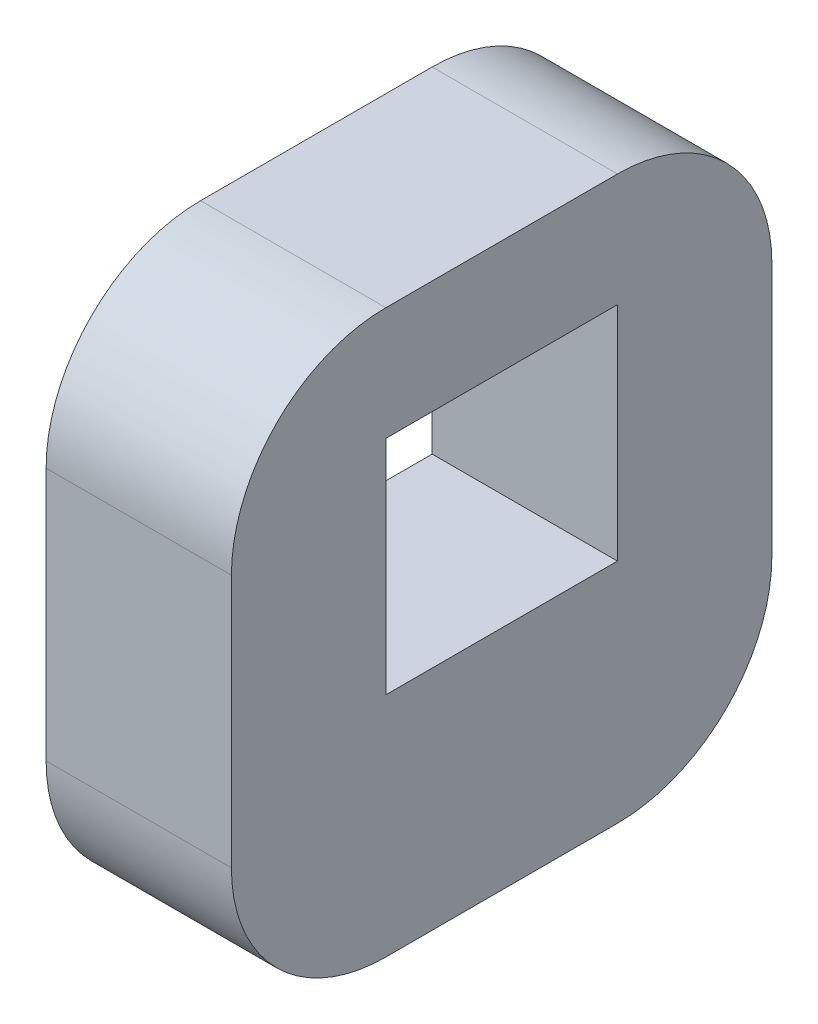
ISO-10303-21;
HEADER;
FILE_DESCRIPTION(('STEP AP214'),'2;1');
FILE_NAME('part.step','',(''),(''),'','','');
FILE_SCHEMA(('AUTOMOTIVE_DESIGN { 1 0 10303 214 1 1 1 1 }'));
ENDSEC;
DATA;
#1=APPLICATION_CONTEXT('core data for automotive mechanical design processes');
#2=APPLICATION_PROTOCOL_DEFINITION('international standard','automotive_design',2000,#1);
#3=PRODUCT_CONTEXT('',#1,'mechanical');
#4=PRODUCT('Part','Part','',(#3));
#5=PRODUCT_RELATED_PRODUCT_CATEGORY('part','',(#4));
#6=PRODUCT_DEFINITION_FORMATION('','',#4);
#7=PRODUCT_DEFINITION_CONTEXT('part definition',#1,'design');
#8=PRODUCT_DEFINITION('design','',#6,#7);
#9=PRODUCT_DEFINITION_SHAPE('','',#8);
#10=(LENGTH_UNIT() NAMED_UNIT(*) SI_UNIT(.MILLI.,.METRE.));
#11=(NAMED_UNIT(*) PLANE_ANGLE_UNIT() SI_UNIT($,.RADIAN.));
#12=(NAMED_UNIT(*) SI_UNIT($,.STERADIAN.) SOLID_ANGLE_UNIT());
#13=UNCERTAINTY_MEASURE_WITH_UNIT(LENGTH_MEASURE(1.E-05),#10,'distance_accuracy_value','');
#14=(GEOMETRIC_REPRESENTATION_CONTEXT(3) GLOBAL_UNCERTAINTY_ASSIGNED_CONTEXT((#13)) GLOBAL_UNIT_ASSIGNED_CONTEXT((#10,
#11,#12)) REPRESENTATION_CONTEXT('',''));
#15=CARTESIAN_POINT('',(0.,0.,0.));
#16=DIRECTION('',(0.,0.,1.));
#17=DIRECTION('',(1.,0.,0.));
#18=AXIS2_PLACEMENT_3D('',#15,#16,#17);
#19=CARTESIAN_POINT('',(69.9352461515029,5.5,6.75));
#20=DIRECTION('',(1.,0.,0.));
#21=DIRECTION('',(0.,0.,-1.));
#22=AXIS2_PLACEMENT_3D('',#19,#20,#21);
#23=PLANE('',#22);
#24=DIRECTION('',(0.,0.,-1.));
#25=VECTOR('',#24,1.);
#26=CARTESIAN_POINT('',(69.9352461515029,-7.70774354332595,11.75));
#27=LINE('',#26,#25);
#28=CARTESIAN_POINT('',(69.9352461515029,-7.70774354332595,6.75));
#29=VERTEX_POINT('',#28);
#30=CARTESIAN_POINT('',(69.9352461515029,-7.70774354332595,-0.749999999999997));
#31=VERTEX_POINT('',#30);
#32=EDGE_CURVE('E168',#29,#31,#27,.T.);
#33=ORIENTED_EDGE('',*,*,#32,.T.);
#34=CARTESIAN_POINT('',(69.9352461515029,-2.70774354332595,-0.749999999999997));
#35=DIRECTION('',(1.,0.,0.));
#36=DIRECTION('',(0.,0.,-1.));
#37=AXIS2_PLACEMENT_3D('',#34,#35,#36);
#38=CIRCLE('',#37,5.);
#39=CARTESIAN_POINT('',(69.9352461515029,-2.70774354332595,-5.75));
#40=VERTEX_POINT('',#39);
#41=EDGE_CURVE('E38',#31,#40,#38,.T.);
#42=ORIENTED_EDGE('',*,*,#41,.T.);
#43=DIRECTION('',(0.,1.,0.));
#44=VECTOR('',#43,1.);
#45=CARTESIAN_POINT('',(69.9352461515029,-7.70774354332595,-5.75));
#46=LINE('',#45,#44);
#47=CARTESIAN_POINT('',(69.9352461515029,5.5,-5.75));
#48=VERTEX_POINT('',#47);
#49=EDGE_CURVE('E170',#40,#48,#46,.T.);
#50=ORIENTED_EDGE('',*,*,#49,.T.);
#51=CARTESIAN_POINT('',(69.9352461515029,5.5,-0.749999999999997));
#52=DIRECTION('',(1.,0.,0.));
#53=DIRECTION('',(0.,0.,1.));
#54=AXIS2_PLACEMENT_3D('',#51,#52,#53);
#55=CIRCLE('',#54,5.);
#56=CARTESIAN_POINT('',(69.9352461515029,10.5,-0.749999999999997));
#57=VERTEX_POINT('',#56);
#58=EDGE_CURVE('E172',#48,#57,#55,.T.);
#59=ORIENTED_EDGE('',*,*,#58,.T.);
#60=DIRECTION('',(0.,0.,1.));
#61=VECTOR('',#60,1.);
#62=CARTESIAN_POINT('',(69.9352461515029,10.5,6.75));
#63=LINE('',#62,#61);
#64=CARTESIAN_POINT('',(69.9352461515029,10.5,6.75));
#65=VERTEX_POINT('',#64);
#66=EDGE_CURVE('E174',#57,#65,#63,.T.);
#67=ORIENTED_EDGE('',*,*,#66,.T.);
#68=CARTESIAN_POINT('',(69.9352461515029,5.5,6.75));
#69=DIRECTION('',(1.,0.,0.));
#70=DIRECTION('',(0.,0.,-1.));
#71=AXIS2_PLACEMENT_3D('',#68,#69,#70);
#72=CIRCLE('',#71,5.);
#73=CARTESIAN_POINT('',(69.9352461515029,5.5,11.75));
#74=VERTEX_POINT('',#73);
#75=EDGE_CURVE('E162',#65,#74,#72,.T.);
#76=ORIENTED_EDGE('',*,*,#75,.T.);
#77=DIRECTION('',(0.,-1.,0.));
#78=VECTOR('',#77,1.);
#79=CARTESIAN_POINT('',(69.9352461515029,5.5,11.75));
#80=LINE('',#79,#78);
#81=CARTESIAN_POINT('',(69.9352461515029,-2.70774354332595,11.75));
#82=VERTEX_POINT('',#81);
#83=EDGE_CURVE('E165',#74,#82,#80,.T.);
#84=ORIENTED_EDGE('',*,*,#83,.T.);
#85=CARTESIAN_POINT('',(69.9352461515029,-2.70774354332595,6.75));
#86=DIRECTION('',(1.,0.,0.));
#87=DIRECTION('',(0.,0.,-1.));
#88=AXIS2_PLACEMENT_3D('',#85,#86,#87);
#89=CIRCLE('',#88,5.);
#90=EDGE_CURVE('E210',#82,#29,#89,.T.);
#91=ORIENTED_EDGE('',*,*,#90,.T.);
#92=EDGE_LOOP('',(#33,#42,#50,#59,#67,#76,#84,#91));
#93=FACE_BOUND('',#92,.T.);
#94=DIRECTION('',(0.,0.,-1.));
#95=VECTOR('',#94,1.);
#96=CARTESIAN_POINT('',(69.9352461515029,-0.355000000000019,6.75));
#97=LINE('',#96,#95);
#98=CARTESIAN_POINT('',(69.9352461515029,-0.355000000000019,6.75));
#99=VERTEX_POINT('',#98);
#100=CARTESIAN_POINT('',(69.9352461515029,-0.355000000000019,-0.749999999999997));
#101=VERTEX_POINT('',#100);
#102=EDGE_CURVE('E131',#99,#101,#97,.T.);
#103=ORIENTED_EDGE('',*,*,#102,.F.);
#104=DIRECTION('',(0.,-1.,0.));
#105=VECTOR('',#104,1.);
#106=CARTESIAN_POINT('',(69.9352461515029,6.83499999999998,6.75));
#107=LINE('',#106,#105);
#108=CARTESIAN_POINT('',(69.9352461515029,6.83499999999998,6.75));
#109=VERTEX_POINT('',#108);
#110=EDGE_CURVE('E121',#109,#99,#107,.T.);
#111=ORIENTED_EDGE('',*,*,#110,.F.);
#112=DIRECTION('',(0.,0.,1.));
#113=VECTOR('',#112,1.);
#114=CARTESIAN_POINT('',(69.9352461515029,6.83499999999998,6.75));
#115=LINE('',#114,#113);
#116=CARTESIAN_POINT('',(69.9352461515029,6.83499999999998,-0.749999999999996));
#117=VERTEX_POINT('',#116);
#118=EDGE_CURVE('E146',#117,#109,#115,.T.);
#119=ORIENTED_EDGE('',*,*,#118,.F.);
#120=DIRECTION('',(0.,1.,0.));
#121=VECTOR('',#120,1.);
#122=CARTESIAN_POINT('',(69.9352461515029,6.83499999999998,-0.749999999999996));
#123=LINE('',#122,#121);
#124=EDGE_CURVE('E144',#101,#117,#123,.T.);
#125=ORIENTED_EDGE('',*,*,#124,.F.);
#126=EDGE_LOOP('',(#103,#111,#119,#125));
#127=FACE_BOUND('',#126,.T.);
#128=ADVANCED_FACE('F30',(#93,#127),#23,.T.);
#129=CARTESIAN_POINT('',(63.9352461515029,5.5,6.75));
#130=DIRECTION('',(1.,0.,0.));
#131=DIRECTION('',(0.,0.,-1.));
#132=AXIS2_PLACEMENT_3D('',#129,#130,#131);
#133=PLANE('',#132);
#134=DIRECTION('',(0.,1.,0.));
#135=VECTOR('',#134,1.);
#136=CARTESIAN_POINT('',(63.9352461515029,-7.70774354332595,-5.75));
#137=LINE('',#136,#135);
#138=CARTESIAN_POINT('',(63.9352461515029,-2.70774354332595,-5.75));
#139=VERTEX_POINT('',#138);
#140=CARTESIAN_POINT('',(63.9352461515029,5.5,-5.75));
#141=VERTEX_POINT('',#140);
#142=EDGE_CURVE('E183',#139,#141,#137,.T.);
#143=ORIENTED_EDGE('',*,*,#142,.F.);
#144=CARTESIAN_POINT('',(63.9352461515029,-2.70774354332595,-0.749999999999997));
#145=DIRECTION('',(1.,0.,0.));
#146=DIRECTION('',(0.,0.,-1.));
#147=AXIS2_PLACEMENT_3D('',#144,#145,#146);
#148=CIRCLE('',#147,5.);
#149=CARTESIAN_POINT('',(63.9352461515029,-7.70774354332595,-0.749999999999997));
#150=VERTEX_POINT('',#149);
#151=EDGE_CURVE('E204',#139,#150,#148,.F.);
#152=ORIENTED_EDGE('',*,*,#151,.T.);
#153=DIRECTION('',(0.,0.,-1.));
#154=VECTOR('',#153,1.);
#155=CARTESIAN_POINT('',(63.9352461515029,-7.70774354332595,11.75));
#156=LINE('',#155,#154);
#157=CARTESIAN_POINT('',(63.9352461515029,-7.70774354332595,6.75));
#158=VERTEX_POINT('',#157);
#159=EDGE_CURVE('E181',#158,#150,#156,.T.);
#160=ORIENTED_EDGE('',*,*,#159,.F.);
#161=CARTESIAN_POINT('',(63.9352461515029,-2.70774354332595,6.75));
#162=DIRECTION('',(1.,0.,0.));
#163=DIRECTION('',(0.,0.,-1.));
#164=AXIS2_PLACEMENT_3D('',#161,#162,#163);
#165=CIRCLE('',#164,5.);
#166=CARTESIAN_POINT('',(63.9352461515029,-2.70774354332595,11.75));
#167=VERTEX_POINT('',#166);
#168=EDGE_CURVE('E202',#158,#167,#165,.F.);
#169=ORIENTED_EDGE('',*,*,#168,.T.);
#170=DIRECTION('',(0.,-1.,0.));
#171=VECTOR('',#170,1.);
#172=CARTESIAN_POINT('',(63.9352461515029,5.5,11.75));
#173=LINE('',#172,#171);
#174=CARTESIAN_POINT('',(63.9352461515029,5.5,11.75));
#175=VERTEX_POINT('',#174);
#176=EDGE_CURVE('E179',#175,#167,#173,.T.);
#177=ORIENTED_EDGE('',*,*,#176,.F.);
#178=CARTESIAN_POINT('',(63.9352461515029,5.5,6.75));
#179=DIRECTION('',(1.,0.,0.));
#180=DIRECTION('',(0.,0.,-1.));
#181=AXIS2_PLACEMENT_3D('',#178,#179,#180);
#182=CIRCLE('',#181,5.);
#183=CARTESIAN_POINT('',(63.9352461515029,10.5,6.75));
#184=VERTEX_POINT('',#183);
#185=EDGE_CURVE('E139',#184,#175,#182,.T.);
#186=ORIENTED_EDGE('',*,*,#185,.F.);
#187=DIRECTION('',(0.,0.,1.));
#188=VECTOR('',#187,1.);
#189=CARTESIAN_POINT('',(63.9352461515029,10.5,6.75));
#190=LINE('',#189,#188);
#191=CARTESIAN_POINT('',(63.9352461515029,10.5,-0.749999999999997));
#192=VERTEX_POINT('',#191);
#193=EDGE_CURVE('E166',#192,#184,#190,.T.);
#194=ORIENTED_EDGE('',*,*,#193,.F.);
#195=CARTESIAN_POINT('',(63.9352461515029,5.5,-0.749999999999997));
#196=DIRECTION('',(1.,0.,0.));
#197=DIRECTION('',(0.,0.,1.));
#198=AXIS2_PLACEMENT_3D('',#195,#196,#197);
#199=CIRCLE('',#198,5.);
#200=EDGE_CURVE('E185',#141,#192,#199,.T.);
#201=ORIENTED_EDGE('',*,*,#200,.F.);
#202=EDGE_LOOP('',(#143,#152,#160,#169,#177,#186,#194,#201));
#203=FACE_BOUND('',#202,.T.);
#204=DIRECTION('',(0.,-1.,0.));
#205=VECTOR('',#204,1.);
#206=CARTESIAN_POINT('',(63.9352461515029,6.83499999999998,6.75));
#207=LINE('',#206,#205);
#208=CARTESIAN_POINT('',(63.9352461515029,6.83499999999998,6.75));
#209=VERTEX_POINT('',#208);
#210=CARTESIAN_POINT('',(63.9352461515029,-0.355000000000019,6.75));
#211=VERTEX_POINT('',#210);
#212=EDGE_CURVE('E150',#209,#211,#207,.T.);
#213=ORIENTED_EDGE('',*,*,#212,.T.);
#214=DIRECTION('',(0.,0.,-1.));
#215=VECTOR('',#214,1.);
#216=CARTESIAN_POINT('',(63.9352461515029,-0.355000000000019,6.75));
#217=LINE('',#216,#215);
#218=CARTESIAN_POINT('',(63.9352461515029,-0.355000000000019,-0.749999999999997));
#219=VERTEX_POINT('',#218);
#220=EDGE_CURVE('E138',#211,#219,#217,.T.);
#221=ORIENTED_EDGE('',*,*,#220,.T.);
#222=DIRECTION('',(0.,1.,0.));
#223=VECTOR('',#222,1.);
#224=CARTESIAN_POINT('',(63.9352461515029,6.83499999999998,-0.749999999999996));
#225=LINE('',#224,#223);
#226=CARTESIAN_POINT('',(63.9352461515029,6.83499999999998,-0.749999999999996));
#227=VERTEX_POINT('',#226);
#228=EDGE_CURVE('E153',#219,#227,#225,.T.);
#229=ORIENTED_EDGE('',*,*,#228,.T.);
#230=DIRECTION('',(0.,0.,1.));
#231=VECTOR('',#230,1.);
#232=CARTESIAN_POINT('',(63.9352461515029,6.83499999999998,6.75));
#233=LINE('',#232,#231);
#234=EDGE_CURVE('E132',#227,#209,#233,.T.);
#235=ORIENTED_EDGE('',*,*,#234,.T.);
#236=EDGE_LOOP('',(#213,#221,#229,#235));
#237=FACE_BOUND('',#236,.T.);
#238=ADVANCED_FACE('F224',(#203,#237),#133,.F.);
#239=CARTESIAN_POINT('',(69.9352461515029,5.5,6.75));
#240=DIRECTION('',(-1.,0.,0.));
#241=DIRECTION('',(0.,0.,1.));
#242=AXIS2_PLACEMENT_3D('',#239,#240,#241);
#243=CYLINDRICAL_SURFACE('',#242,5.);
#244=ORIENTED_EDGE('',*,*,#185,.T.);
#245=DIRECTION('',(-1.,0.,0.));
#246=VECTOR('',#245,1.);
#247=CARTESIAN_POINT('',(69.9352461515029,5.5,11.75));
#248=LINE('',#247,#246);
#249=EDGE_CURVE('E196',#74,#175,#248,.T.);
#250=ORIENTED_EDGE('',*,*,#249,.F.);
#251=ORIENTED_EDGE('',*,*,#75,.F.);
#252=DIRECTION('',(-1.,0.,0.));
#253=VECTOR('',#252,1.);
#254=CARTESIAN_POINT('',(69.9352461515029,10.5,6.75));
#255=LINE('',#254,#253);
#256=EDGE_CURVE('E176',#65,#184,#255,.T.);
#257=ORIENTED_EDGE('',*,*,#256,.T.);
#258=EDGE_LOOP('',(#244,#250,#251,#257));
#259=FACE_BOUND('',#258,.T.);
#260=ADVANCED_FACE('F236',(#259),#243,.T.);
#261=CARTESIAN_POINT('',(69.9352461515029,5.5,11.75));
#262=DIRECTION('',(0.,0.,-1.));
#263=DIRECTION('',(0.,1.,0.));
#264=AXIS2_PLACEMENT_3D('',#261,#262,#263);
#265=PLANE('',#264);
#266=ORIENTED_EDGE('',*,*,#176,.T.);
#267=DIRECTION('',(-1.,0.,0.));
#268=VECTOR('',#267,1.);
#269=CARTESIAN_POINT('',(69.9352461515029,-2.70774354332595,11.75));
#270=LINE('',#269,#268);
#271=EDGE_CURVE('E11',#167,#82,#270,.F.);
#272=ORIENTED_EDGE('',*,*,#271,.T.);
#273=ORIENTED_EDGE('',*,*,#83,.F.);
#274=ORIENTED_EDGE('',*,*,#249,.T.);
#275=EDGE_LOOP('',(#266,#272,#273,#274));
#276=FACE_BOUND('',#275,.T.);
#277=ADVANCED_FACE('F232',(#276),#265,.F.);
#278=CARTESIAN_POINT('',(69.9352461515029,-7.70774354332595,11.75));
#279=DIRECTION('',(0.,1.,0.));
#280=DIRECTION('',(0.,0.,1.));
#281=AXIS2_PLACEMENT_3D('',#278,#279,#280);
#282=PLANE('',#281);
#283=ORIENTED_EDGE('',*,*,#159,.T.);
#284=DIRECTION('',(-1.,0.,0.));
#285=VECTOR('',#284,1.);
#286=CARTESIAN_POINT('',(69.9352461515029,-7.70774354332595,-0.749999999999997));
#287=LINE('',#286,#285);
#288=EDGE_CURVE('E51',#150,#31,#287,.F.);
#289=ORIENTED_EDGE('',*,*,#288,.T.);
#290=ORIENTED_EDGE('',*,*,#32,.F.);
#291=DIRECTION('',(-1.,0.,0.));
#292=VECTOR('',#291,1.);
#293=CARTESIAN_POINT('',(69.9352461515029,-7.70774354332595,6.75));
#294=LINE('',#293,#292);
#295=EDGE_CURVE('E206',#29,#158,#294,.T.);
#296=ORIENTED_EDGE('',*,*,#295,.T.);
#297=EDGE_LOOP('',(#283,#289,#290,#296));
#298=FACE_BOUND('',#297,.T.);
#299=ADVANCED_FACE('F227',(#298),#282,.F.);
#300=CARTESIAN_POINT('',(69.9352461515029,-7.70774354332595,-5.75));
#301=DIRECTION('',(0.,0.,1.));
#302=DIRECTION('',(1.,0.,0.));
#303=AXIS2_PLACEMENT_3D('',#300,#301,#302);
#304=PLANE('',#303);
#305=ORIENTED_EDGE('',*,*,#49,.F.);
#306=DIRECTION('',(-1.,0.,0.));
#307=VECTOR('',#306,1.);
#308=CARTESIAN_POINT('',(69.9352461515029,-2.70774354332595,-5.75));
#309=LINE('',#308,#307);
#310=EDGE_CURVE('E199',#40,#139,#309,.T.);
#311=ORIENTED_EDGE('',*,*,#310,.T.);
#312=ORIENTED_EDGE('',*,*,#142,.T.);
#313=DIRECTION('',(-1.,0.,0.));
#314=VECTOR('',#313,1.);
#315=CARTESIAN_POINT('',(69.9352461515029,5.5,-5.75));
#316=LINE('',#315,#314);
#317=EDGE_CURVE('E193',#48,#141,#316,.T.);
#318=ORIENTED_EDGE('',*,*,#317,.F.);
#319=EDGE_LOOP('',(#305,#311,#312,#318));
#320=FACE_BOUND('',#319,.T.);
#321=ADVANCED_FACE('F218',(#320),#304,.F.);
#322=CARTESIAN_POINT('',(69.9352461515029,5.5,-0.749999999999997));
#323=DIRECTION('',(-1.,0.,0.));
#324=DIRECTION('',(0.,0.,1.));
#325=AXIS2_PLACEMENT_3D('',#322,#323,#324);
#326=CYLINDRICAL_SURFACE('',#325,5.);
#327=ORIENTED_EDGE('',*,*,#200,.T.);
#328=DIRECTION('',(-1.,0.,0.));
#329=VECTOR('',#328,1.);
#330=CARTESIAN_POINT('',(69.9352461515029,10.5,-0.749999999999997));
#331=LINE('',#330,#329);
#332=EDGE_CURVE('E190',#57,#192,#331,.T.);
#333=ORIENTED_EDGE('',*,*,#332,.F.);
#334=ORIENTED_EDGE('',*,*,#58,.F.);
#335=ORIENTED_EDGE('',*,*,#317,.T.);
#336=EDGE_LOOP('',(#327,#333,#334,#335));
#337=FACE_BOUND('',#336,.T.);
#338=ADVANCED_FACE('F244',(#337),#326,.T.);
#339=CARTESIAN_POINT('',(69.9352461515029,10.5,6.75));
#340=DIRECTION('',(0.,-1.,0.));
#341=DIRECTION('',(0.,0.,-1.));
#342=AXIS2_PLACEMENT_3D('',#339,#340,#341);
#343=PLANE('',#342);
#344=ORIENTED_EDGE('',*,*,#193,.T.);
#345=ORIENTED_EDGE('',*,*,#256,.F.);
#346=ORIENTED_EDGE('',*,*,#66,.F.);
#347=ORIENTED_EDGE('',*,*,#332,.T.);
#348=EDGE_LOOP('',(#344,#345,#346,#347));
#349=FACE_BOUND('',#348,.T.);
#350=ADVANCED_FACE('F240',(#349),#343,.F.);
#351=CARTESIAN_POINT('',(69.9352461515029,6.83499999999998,6.75));
#352=DIRECTION('',(0.,0.,-1.));
#353=DIRECTION('',(0.,1.,0.));
#354=AXIS2_PLACEMENT_3D('',#351,#352,#353);
#355=PLANE('',#354);
#356=ORIENTED_EDGE('',*,*,#212,.F.);
#357=DIRECTION('',(-1.,0.,0.));
#358=VECTOR('',#357,1.);
#359=CARTESIAN_POINT('',(69.9352461515029,6.83499999999998,6.75));
#360=LINE('',#359,#358);
#361=EDGE_CURVE('E127',#109,#209,#360,.T.);
#362=ORIENTED_EDGE('',*,*,#361,.F.);
#363=ORIENTED_EDGE('',*,*,#110,.T.);
#364=DIRECTION('',(-1.,0.,0.));
#365=VECTOR('',#364,1.);
#366=CARTESIAN_POINT('',(69.9352461515029,-0.355000000000019,6.75));
#367=LINE('',#366,#365);
#368=EDGE_CURVE('E124',#99,#211,#367,.T.);
#369=ORIENTED_EDGE('',*,*,#368,.T.);
#370=EDGE_LOOP('',(#356,#362,#363,#369));
#371=FACE_BOUND('',#370,.T.);
#372=ADVANCED_FACE('F123',(#371),#355,.T.);
#373=CARTESIAN_POINT('',(69.9352461515029,-0.355000000000019,6.75));
#374=DIRECTION('',(0.,1.,0.));
#375=DIRECTION('',(0.,0.,1.));
#376=AXIS2_PLACEMENT_3D('',#373,#374,#375);
#377=PLANE('',#376);
#378=ORIENTED_EDGE('',*,*,#220,.F.);
#379=ORIENTED_EDGE('',*,*,#368,.F.);
#380=ORIENTED_EDGE('',*,*,#102,.T.);
#381=DIRECTION('',(-1.,0.,0.));
#382=VECTOR('',#381,1.);
#383=CARTESIAN_POINT('',(69.9352461515029,-0.355000000000019,-0.749999999999997));
#384=LINE('',#383,#382);
#385=EDGE_CURVE('E140',#101,#219,#384,.T.);
#386=ORIENTED_EDGE('',*,*,#385,.T.);
#387=EDGE_LOOP('',(#378,#379,#380,#386));
#388=FACE_BOUND('',#387,.T.);
#389=ADVANCED_FACE('F135',(#388),#377,.T.);
#390=CARTESIAN_POINT('',(69.9352461515029,6.83499999999998,-0.749999999999996));
#391=DIRECTION('',(0.,0.,1.));
#392=DIRECTION('',(0.,-1.,0.));
#393=AXIS2_PLACEMENT_3D('',#390,#391,#392);
#394=PLANE('',#393);
#395=ORIENTED_EDGE('',*,*,#228,.F.);
#396=ORIENTED_EDGE('',*,*,#385,.F.);
#397=ORIENTED_EDGE('',*,*,#124,.T.);
#398=DIRECTION('',(-1.,0.,0.));
#399=VECTOR('',#398,1.);
#400=CARTESIAN_POINT('',(69.9352461515029,6.83499999999998,-0.749999999999996));
#401=LINE('',#400,#399);
#402=EDGE_CURVE('E159',#117,#227,#401,.T.);
#403=ORIENTED_EDGE('',*,*,#402,.T.);
#404=EDGE_LOOP('',(#395,#396,#397,#403));
#405=FACE_BOUND('',#404,.T.);
#406=ADVANCED_FACE('F264',(#405),#394,.T.);
#407=CARTESIAN_POINT('',(69.9352461515029,6.83499999999998,6.75));
#408=DIRECTION('',(0.,-1.,0.));
#409=DIRECTION('',(0.,0.,-1.));
#410=AXIS2_PLACEMENT_3D('',#407,#408,#409);
#411=PLANE('',#410);
#412=ORIENTED_EDGE('',*,*,#234,.F.);
#413=ORIENTED_EDGE('',*,*,#402,.F.);
#414=ORIENTED_EDGE('',*,*,#118,.T.);
#415=ORIENTED_EDGE('',*,*,#361,.T.);
#416=EDGE_LOOP('',(#412,#413,#414,#415));
#417=FACE_BOUND('',#416,.T.);
#418=ADVANCED_FACE('F267',(#417),#411,.T.);
#419=CARTESIAN_POINT('',(69.9352461515029,-2.70774354332595,-0.749999999999997));
#420=DIRECTION('',(-1.,0.,0.));
#421=DIRECTION('',(0.,0.,1.));
#422=AXIS2_PLACEMENT_3D('',#419,#420,#421);
#423=CYLINDRICAL_SURFACE('',#422,5.);
#424=ORIENTED_EDGE('',*,*,#41,.F.);
#425=ORIENTED_EDGE('',*,*,#288,.F.);
#426=ORIENTED_EDGE('',*,*,#151,.F.);
#427=ORIENTED_EDGE('',*,*,#310,.F.);
#428=EDGE_LOOP('',(#424,#425,#426,#427));
#429=FACE_BOUND('',#428,.T.);
#430=ADVANCED_FACE('F221',(#429),#423,.T.);
#431=CARTESIAN_POINT('',(69.9352461515029,-2.70774354332595,6.75));
#432=DIRECTION('',(-1.,0.,0.));
#433=DIRECTION('',(0.,0.,1.));
#434=AXIS2_PLACEMENT_3D('',#431,#432,#433);
#435=CYLINDRICAL_SURFACE('',#434,5.);
#436=ORIENTED_EDGE('',*,*,#90,.F.);
#437=ORIENTED_EDGE('',*,*,#271,.F.);
#438=ORIENTED_EDGE('',*,*,#168,.F.);
#439=ORIENTED_EDGE('',*,*,#295,.F.);
#440=EDGE_LOOP('',(#436,#437,#438,#439));
#441=FACE_BOUND('',#440,.T.);
#442=ADVANCED_FACE('F32',(#441),#435,.T.);
#443=CLOSED_SHELL('',(#128,#238,#260,#277,#299,#321,#338,#350,#372,#389,#406,#418,#430,#442));
#444=MANIFOLD_SOLID_BREP('B2',#443);
#445=ADVANCED_BREP_SHAPE_REPRESENTATION('',(#18,#444),#14);
#446=SHAPE_DEFINITION_REPRESENTATION(#9,#445);
ENDSEC;
END-ISO-10303-21;
